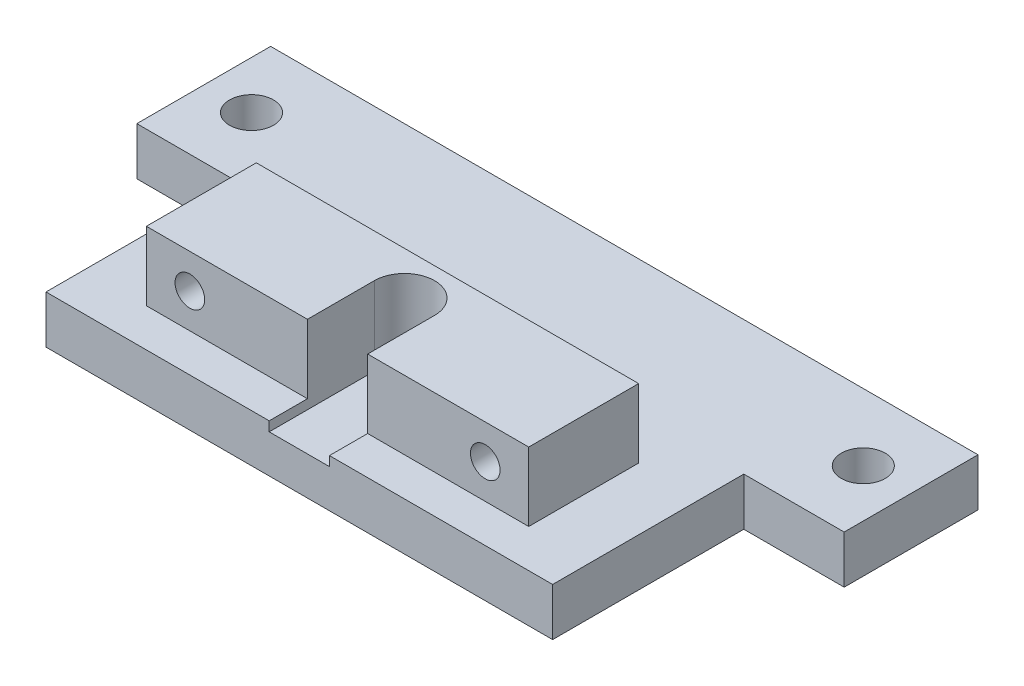
ISO-10303-21;
HEADER;
FILE_DESCRIPTION(('STEP AP214'),'2;1');
FILE_NAME('part.step','',(''),(''),'','','');
FILE_SCHEMA(('AUTOMOTIVE_DESIGN { 1 0 10303 214 1 1 1 1 }'));
ENDSEC;
DATA;
#1=APPLICATION_CONTEXT('core data for automotive mechanical design processes');
#2=APPLICATION_PROTOCOL_DEFINITION('international standard','automotive_design',2000,#1);
#3=PRODUCT_CONTEXT('',#1,'mechanical');
#4=PRODUCT('Part','Part','',(#3));
#5=PRODUCT_RELATED_PRODUCT_CATEGORY('part','',(#4));
#6=PRODUCT_DEFINITION_FORMATION('','',#4);
#7=PRODUCT_DEFINITION_CONTEXT('part definition',#1,'design');
#8=PRODUCT_DEFINITION('design','',#6,#7);
#9=PRODUCT_DEFINITION_SHAPE('','',#8);
#10=(LENGTH_UNIT() NAMED_UNIT(*) SI_UNIT(.MILLI.,.METRE.));
#11=(NAMED_UNIT(*) PLANE_ANGLE_UNIT() SI_UNIT($,.RADIAN.));
#12=(NAMED_UNIT(*) SI_UNIT($,.STERADIAN.) SOLID_ANGLE_UNIT());
#13=UNCERTAINTY_MEASURE_WITH_UNIT(LENGTH_MEASURE(1.E-05),#10,'distance_accuracy_value','');
#14=(GEOMETRIC_REPRESENTATION_CONTEXT(3) GLOBAL_UNCERTAINTY_ASSIGNED_CONTEXT((#13)) GLOBAL_UNIT_ASSIGNED_CONTEXT((#10,
#11,#12)) REPRESENTATION_CONTEXT('',''));
#15=CARTESIAN_POINT('',(0.,0.,0.));
#16=DIRECTION('',(0.,0.,1.));
#17=DIRECTION('',(1.,0.,0.));
#18=AXIS2_PLACEMENT_3D('',#15,#16,#17);
#19=CARTESIAN_POINT('',(0.,5.2,20.));
#20=DIRECTION('',(0.,0.,-1.));
#21=DIRECTION('',(-1.,0.,0.));
#22=AXIS2_PLACEMENT_3D('',#19,#20,#21);
#23=PLANE('',#22);
#24=DIRECTION('',(0.,-1.,0.));
#25=VECTOR('',#24,1.);
#26=CARTESIAN_POINT('',(10.5,5.2,20.));
#27=LINE('',#26,#25);
#28=CARTESIAN_POINT('',(10.5,5.2,20.));
#29=VERTEX_POINT('',#28);
#30=CARTESIAN_POINT('',(10.5,0.2,20.));
#31=VERTEX_POINT('',#30);
#32=EDGE_CURVE('E53',#29,#31,#27,.T.);
#33=ORIENTED_EDGE('',*,*,#32,.T.);
#34=DIRECTION('',(-1.,0.,0.));
#35=VECTOR('',#34,1.);
#36=CARTESIAN_POINT('',(74.,0.2,20.));
#37=LINE('',#36,#35);
#38=CARTESIAN_POINT('',(63.5,0.2,20.));
#39=VERTEX_POINT('',#38);
#40=EDGE_CURVE('E177',#39,#31,#37,.T.);
#41=ORIENTED_EDGE('',*,*,#40,.F.);
#42=DIRECTION('',(0.,-1.,0.));
#43=VECTOR('',#42,1.);
#44=CARTESIAN_POINT('',(63.5,5.2,20.));
#45=LINE('',#44,#43);
#46=CARTESIAN_POINT('',(63.5,5.2,20.));
#47=VERTEX_POINT('',#46);
#48=EDGE_CURVE('E202',#47,#39,#45,.T.);
#49=ORIENTED_EDGE('',*,*,#48,.F.);
#50=DIRECTION('',(1.,0.,0.));
#51=VECTOR('',#50,1.);
#52=CARTESIAN_POINT('',(0.,5.2,20.));
#53=LINE('',#52,#51);
#54=CARTESIAN_POINT('',(40.15,5.2,20.));
#55=VERTEX_POINT('',#54);
#56=EDGE_CURVE('E316',#55,#47,#53,.T.);
#57=ORIENTED_EDGE('',*,*,#56,.F.);
#58=DIRECTION('',(0.,1.,0.));
#59=VECTOR('',#58,1.);
#60=CARTESIAN_POINT('',(40.15,4.2,20.));
#61=LINE('',#60,#59);
#62=CARTESIAN_POINT('',(40.15,4.2,20.));
#63=VERTEX_POINT('',#62);
#64=EDGE_CURVE('E304',#63,#55,#61,.T.);
#65=ORIENTED_EDGE('',*,*,#64,.F.);
#66=DIRECTION('',(1.,0.,0.));
#67=VECTOR('',#66,1.);
#68=CARTESIAN_POINT('',(0.,4.2,20.));
#69=LINE('',#68,#67);
#70=CARTESIAN_POINT('',(33.85,4.2,20.));
#71=VERTEX_POINT('',#70);
#72=EDGE_CURVE('E298',#71,#63,#69,.T.);
#73=ORIENTED_EDGE('',*,*,#72,.F.);
#74=DIRECTION('',(0.,1.,0.));
#75=VECTOR('',#74,1.);
#76=CARTESIAN_POINT('',(33.85,4.2,20.));
#77=LINE('',#76,#75);
#78=CARTESIAN_POINT('',(33.85,5.2,20.));
#79=VERTEX_POINT('',#78);
#80=EDGE_CURVE('E308',#71,#79,#77,.T.);
#81=ORIENTED_EDGE('',*,*,#80,.T.);
#82=EDGE_CURVE('E213',#29,#79,#53,.T.);
#83=ORIENTED_EDGE('',*,*,#82,.F.);
#84=EDGE_LOOP('',(#33,#41,#49,#57,#65,#73,#81,#83));
#85=FACE_BOUND('',#84,.T.);
#86=ADVANCED_FACE('F44',(#85),#23,.F.);
#87=CARTESIAN_POINT('',(0.,5.2,0.));
#88=DIRECTION('',(0.,1.,0.));
#89=DIRECTION('',(0.,0.,1.));
#90=AXIS2_PLACEMENT_3D('',#87,#88,#89);
#91=PLANE('',#90);
#92=DIRECTION('',(1.,0.,0.));
#93=VECTOR('',#92,1.);
#94=CARTESIAN_POINT('',(40.15,5.2,16.));
#95=LINE('',#94,#93);
#96=CARTESIAN_POINT('',(40.15,5.2,16.));
#97=VERTEX_POINT('',#96);
#98=CARTESIAN_POINT('',(57.,5.2,16.));
#99=VERTEX_POINT('',#98);
#100=EDGE_CURVE('E266',#97,#99,#95,.T.);
#101=ORIENTED_EDGE('',*,*,#100,.F.);
#102=DIRECTION('',(0.,0.,1.));
#103=VECTOR('',#102,1.);
#104=CARTESIAN_POINT('',(40.15,5.2,0.));
#105=LINE('',#104,#103);
#106=EDGE_CURVE('E288',#97,#55,#105,.T.);
#107=ORIENTED_EDGE('',*,*,#106,.T.);
#108=ORIENTED_EDGE('',*,*,#56,.T.);
#109=DIRECTION('',(0.,0.,1.));
#110=VECTOR('',#109,1.);
#111=CARTESIAN_POINT('',(63.5,5.2,0.));
#112=LINE('',#111,#110);
#113=CARTESIAN_POINT('',(63.5,5.2,0.));
#114=VERTEX_POINT('',#113);
#115=EDGE_CURVE('E318',#114,#47,#112,.T.);
#116=ORIENTED_EDGE('',*,*,#115,.F.);
#117=DIRECTION('',(1.,0.,0.));
#118=VECTOR('',#117,1.);
#119=CARTESIAN_POINT('',(0.,5.2,0.));
#120=LINE('',#119,#118);
#121=CARTESIAN_POINT('',(74.,5.2,0.));
#122=VERTEX_POINT('',#121);
#123=EDGE_CURVE('E314',#114,#122,#120,.T.);
#124=ORIENTED_EDGE('',*,*,#123,.T.);
#125=DIRECTION('',(0.,0.,-1.));
#126=VECTOR('',#125,1.);
#127=CARTESIAN_POINT('',(74.,5.2,0.));
#128=LINE('',#127,#126);
#129=CARTESIAN_POINT('',(74.,5.2,-14.));
#130=VERTEX_POINT('',#129);
#131=EDGE_CURVE('E321',#122,#130,#128,.T.);
#132=ORIENTED_EDGE('',*,*,#131,.T.);
#133=DIRECTION('',(1.,0.,0.));
#134=VECTOR('',#133,1.);
#135=CARTESIAN_POINT('',(0.,5.2,-14.));
#136=LINE('',#135,#134);
#137=CARTESIAN_POINT('',(0.,5.2,-14.));
#138=VERTEX_POINT('',#137);
#139=EDGE_CURVE('E191',#138,#130,#136,.T.);
#140=ORIENTED_EDGE('',*,*,#139,.F.);
#141=DIRECTION('',(0.,0.,-1.));
#142=VECTOR('',#141,1.);
#143=CARTESIAN_POINT('',(0.,5.2,0.));
#144=LINE('',#143,#142);
#145=CARTESIAN_POINT('',(0.,5.2,0.));
#146=VERTEX_POINT('',#145);
#147=EDGE_CURVE('E324',#146,#138,#144,.T.);
#148=ORIENTED_EDGE('',*,*,#147,.F.);
#149=CARTESIAN_POINT('',(10.5,5.2,0.));
#150=VERTEX_POINT('',#149);
#151=EDGE_CURVE('E307',#146,#150,#120,.T.);
#152=ORIENTED_EDGE('',*,*,#151,.T.);
#153=DIRECTION('',(0.,0.,1.));
#154=VECTOR('',#153,1.);
#155=CARTESIAN_POINT('',(10.5,5.2,0.));
#156=LINE('',#155,#154);
#157=EDGE_CURVE('E216',#150,#29,#156,.T.);
#158=ORIENTED_EDGE('',*,*,#157,.T.);
#159=ORIENTED_EDGE('',*,*,#82,.T.);
#160=DIRECTION('',(0.,0.,1.));
#161=VECTOR('',#160,1.);
#162=CARTESIAN_POINT('',(33.85,5.2,0.));
#163=LINE('',#162,#161);
#164=CARTESIAN_POINT('',(33.85,5.2,16.));
#165=VERTEX_POINT('',#164);
#166=EDGE_CURVE('E292',#165,#79,#163,.T.);
#167=ORIENTED_EDGE('',*,*,#166,.F.);
#168=DIRECTION('',(1.,0.,0.));
#169=VECTOR('',#168,1.);
#170=CARTESIAN_POINT('',(17.,5.2,16.));
#171=LINE('',#170,#169);
#172=CARTESIAN_POINT('',(17.,5.2,16.));
#173=VERTEX_POINT('',#172);
#174=EDGE_CURVE('E263',#173,#165,#171,.T.);
#175=ORIENTED_EDGE('',*,*,#174,.F.);
#176=DIRECTION('',(0.,0.,1.));
#177=VECTOR('',#176,1.);
#178=CARTESIAN_POINT('',(17.,5.2,16.));
#179=LINE('',#178,#177);
#180=CARTESIAN_POINT('',(17.,5.2,4.5));
#181=VERTEX_POINT('',#180);
#182=EDGE_CURVE('E239',#181,#173,#179,.T.);
#183=ORIENTED_EDGE('',*,*,#182,.F.);
#184=DIRECTION('',(-1.,0.,0.));
#185=VECTOR('',#184,1.);
#186=CARTESIAN_POINT('',(17.,5.2,4.5));
#187=LINE('',#186,#185);
#188=CARTESIAN_POINT('',(57.,5.2,4.5));
#189=VERTEX_POINT('',#188);
#190=EDGE_CURVE('E244',#189,#181,#187,.T.);
#191=ORIENTED_EDGE('',*,*,#190,.F.);
#192=DIRECTION('',(0.,0.,-1.));
#193=VECTOR('',#192,1.);
#194=CARTESIAN_POINT('',(57.,5.2,16.));
#195=LINE('',#194,#193);
#196=EDGE_CURVE('E68',#99,#189,#195,.T.);
#197=ORIENTED_EDGE('',*,*,#196,.F.);
#198=EDGE_LOOP('',(#101,#107,#108,#116,#124,#132,#140,#148,#152,#158,#159,#167,#175,#183,#191,#197));
#199=FACE_BOUND('',#198,.T.);
#200=CARTESIAN_POINT('',(5.,5.2,-7.));
#201=DIRECTION('',(0.,1.,0.));
#202=DIRECTION('',(0.,0.,1.));
#203=AXIS2_PLACEMENT_3D('',#200,#201,#202);
#204=CIRCLE('',#203,2.3);
#205=CARTESIAN_POINT('',(5.,5.2,-4.7));
#206=VERTEX_POINT('',#205);
#207=EDGE_CURVE('E327',#206,#206,#204,.T.);
#208=ORIENTED_EDGE('',*,*,#207,.F.);
#209=EDGE_LOOP('',(#208));
#210=FACE_BOUND('',#209,.T.);
#211=CARTESIAN_POINT('',(69.,5.2,-7.));
#212=DIRECTION('',(0.,1.,0.));
#213=DIRECTION('',(0.,0.,1.));
#214=AXIS2_PLACEMENT_3D('',#211,#212,#213);
#215=CIRCLE('',#214,2.30000000000001);
#216=CARTESIAN_POINT('',(69.,5.2,-4.69999999999999));
#217=VERTEX_POINT('',#216);
#218=EDGE_CURVE('E330',#217,#217,#215,.F.);
#219=ORIENTED_EDGE('',*,*,#218,.T.);
#220=EDGE_LOOP('',(#219));
#221=FACE_BOUND('',#220,.T.);
#222=ADVANCED_FACE('F354',(#199,#210,#221),#91,.T.);
#223=CARTESIAN_POINT('',(0.,5.2,0.));
#224=DIRECTION('',(0.,0.,-1.));
#225=DIRECTION('',(-1.,0.,0.));
#226=AXIS2_PLACEMENT_3D('',#223,#224,#225);
#227=PLANE('',#226);
#228=DIRECTION('',(0.,-1.,0.));
#229=VECTOR('',#228,1.);
#230=CARTESIAN_POINT('',(0.,5.2,0.));
#231=LINE('',#230,#229);
#232=CARTESIAN_POINT('',(0.,0.2,0.));
#233=VERTEX_POINT('',#232);
#234=EDGE_CURVE('E196',#146,#233,#231,.T.);
#235=ORIENTED_EDGE('',*,*,#234,.T.);
#236=DIRECTION('',(1.,0.,0.));
#237=VECTOR('',#236,1.);
#238=CARTESIAN_POINT('',(0.,0.2,0.));
#239=LINE('',#238,#237);
#240=CARTESIAN_POINT('',(10.5,0.2,0.));
#241=VERTEX_POINT('',#240);
#242=EDGE_CURVE('E60',#233,#241,#239,.T.);
#243=ORIENTED_EDGE('',*,*,#242,.T.);
#244=DIRECTION('',(0.,-1.,0.));
#245=VECTOR('',#244,1.);
#246=CARTESIAN_POINT('',(10.5,5.2,0.));
#247=LINE('',#246,#245);
#248=EDGE_CURVE('E11',#150,#241,#247,.T.);
#249=ORIENTED_EDGE('',*,*,#248,.F.);
#250=ORIENTED_EDGE('',*,*,#151,.F.);
#251=EDGE_LOOP('',(#235,#243,#249,#250));
#252=FACE_BOUND('',#251,.T.);
#253=ADVANCED_FACE('F335',(#252),#227,.F.);
#254=CARTESIAN_POINT('',(10.5,5.2,0.));
#255=DIRECTION('',(1.,0.,0.));
#256=DIRECTION('',(0.,0.,-1.));
#257=AXIS2_PLACEMENT_3D('',#254,#255,#256);
#258=PLANE('',#257);
#259=ORIENTED_EDGE('',*,*,#248,.T.);
#260=DIRECTION('',(0.,0.,1.));
#261=VECTOR('',#260,1.);
#262=CARTESIAN_POINT('',(10.5,0.2,0.));
#263=LINE('',#262,#261);
#264=EDGE_CURVE('E218',#241,#31,#263,.T.);
#265=ORIENTED_EDGE('',*,*,#264,.T.);
#266=ORIENTED_EDGE('',*,*,#32,.F.);
#267=ORIENTED_EDGE('',*,*,#157,.F.);
#268=EDGE_LOOP('',(#259,#265,#266,#267));
#269=FACE_BOUND('',#268,.T.);
#270=ADVANCED_FACE('F46',(#269),#258,.F.);
#271=CARTESIAN_POINT('',(63.5,5.2,0.));
#272=DIRECTION('',(1.,0.,0.));
#273=DIRECTION('',(0.,0.,-1.));
#274=AXIS2_PLACEMENT_3D('',#271,#272,#273);
#275=PLANE('',#274);
#276=DIRECTION('',(0.,0.,1.));
#277=VECTOR('',#276,1.);
#278=CARTESIAN_POINT('',(63.5,0.2,0.));
#279=LINE('',#278,#277);
#280=CARTESIAN_POINT('',(63.5,0.2,0.));
#281=VERTEX_POINT('',#280);
#282=EDGE_CURVE('E220',#281,#39,#279,.T.);
#283=ORIENTED_EDGE('',*,*,#282,.F.);
#284=DIRECTION('',(0.,-1.,0.));
#285=VECTOR('',#284,1.);
#286=CARTESIAN_POINT('',(63.5,5.2,0.));
#287=LINE('',#286,#285);
#288=EDGE_CURVE('E194',#114,#281,#287,.T.);
#289=ORIENTED_EDGE('',*,*,#288,.F.);
#290=ORIENTED_EDGE('',*,*,#115,.T.);
#291=ORIENTED_EDGE('',*,*,#48,.T.);
#292=EDGE_LOOP('',(#283,#289,#290,#291));
#293=FACE_BOUND('',#292,.T.);
#294=ADVANCED_FACE('F349',(#293),#275,.T.);
#295=ORIENTED_EDGE('',*,*,#288,.T.);
#296=DIRECTION('',(1.,0.,0.));
#297=VECTOR('',#296,1.);
#298=CARTESIAN_POINT('',(0.,0.2,0.));
#299=LINE('',#298,#297);
#300=CARTESIAN_POINT('',(74.,0.2,0.));
#301=VERTEX_POINT('',#300);
#302=EDGE_CURVE('E224',#281,#301,#299,.T.);
#303=ORIENTED_EDGE('',*,*,#302,.T.);
#304=DIRECTION('',(0.,-1.,0.));
#305=VECTOR('',#304,1.);
#306=CARTESIAN_POINT('',(74.,5.2,0.));
#307=LINE('',#306,#305);
#308=EDGE_CURVE('E187',#122,#301,#307,.T.);
#309=ORIENTED_EDGE('',*,*,#308,.F.);
#310=ORIENTED_EDGE('',*,*,#123,.F.);
#311=EDGE_LOOP('',(#295,#303,#309,#310));
#312=FACE_BOUND('',#311,.T.);
#313=ADVANCED_FACE('F345',(#312),#227,.F.);
#314=CARTESIAN_POINT('',(74.,5.2,0.));
#315=DIRECTION('',(-1.,0.,0.));
#316=DIRECTION('',(0.,0.,1.));
#317=AXIS2_PLACEMENT_3D('',#314,#315,#316);
#318=PLANE('',#317);
#319=ORIENTED_EDGE('',*,*,#308,.T.);
#320=DIRECTION('',(0.,0.,-1.));
#321=VECTOR('',#320,1.);
#322=CARTESIAN_POINT('',(74.,0.2,-14.));
#323=LINE('',#322,#321);
#324=CARTESIAN_POINT('',(74.,0.2,-14.));
#325=VERTEX_POINT('',#324);
#326=EDGE_CURVE('E171',#301,#325,#323,.T.);
#327=ORIENTED_EDGE('',*,*,#326,.T.);
#328=DIRECTION('',(0.,-1.,0.));
#329=VECTOR('',#328,1.);
#330=CARTESIAN_POINT('',(74.,5.2,-14.));
#331=LINE('',#330,#329);
#332=EDGE_CURVE('E184',#130,#325,#331,.T.);
#333=ORIENTED_EDGE('',*,*,#332,.F.);
#334=ORIENTED_EDGE('',*,*,#131,.F.);
#335=EDGE_LOOP('',(#319,#327,#333,#334));
#336=FACE_BOUND('',#335,.T.);
#337=ADVANCED_FACE('F182',(#336),#318,.F.);
#338=CARTESIAN_POINT('',(0.,5.2,-14.));
#339=DIRECTION('',(0.,0.,-1.));
#340=DIRECTION('',(-1.,0.,0.));
#341=AXIS2_PLACEMENT_3D('',#338,#339,#340);
#342=PLANE('',#341);
#343=DIRECTION('',(-1.,0.,0.));
#344=VECTOR('',#343,1.);
#345=CARTESIAN_POINT('',(74.,0.2,-14.));
#346=LINE('',#345,#344);
#347=CARTESIAN_POINT('',(0.,0.2,-14.));
#348=VERTEX_POINT('',#347);
#349=EDGE_CURVE('E168',#325,#348,#346,.T.);
#350=ORIENTED_EDGE('',*,*,#349,.T.);
#351=DIRECTION('',(0.,-1.,0.));
#352=VECTOR('',#351,1.);
#353=CARTESIAN_POINT('',(0.,5.2,-14.));
#354=LINE('',#353,#352);
#355=EDGE_CURVE('E192',#138,#348,#354,.T.);
#356=ORIENTED_EDGE('',*,*,#355,.F.);
#357=ORIENTED_EDGE('',*,*,#139,.T.);
#358=ORIENTED_EDGE('',*,*,#332,.T.);
#359=EDGE_LOOP('',(#350,#356,#357,#358));
#360=FACE_BOUND('',#359,.T.);
#361=ADVANCED_FACE('F189',(#360),#342,.T.);
#362=CARTESIAN_POINT('',(5.,5.2,-7.));
#363=DIRECTION('',(0.,-1.,0.));
#364=DIRECTION('',(0.,0.,-1.));
#365=AXIS2_PLACEMENT_3D('',#362,#363,#364);
#366=CYLINDRICAL_SURFACE('',#365,2.3);
#367=CARTESIAN_POINT('',(5.,0.2,-7.));
#368=DIRECTION('',(0.,1.,0.));
#369=DIRECTION('',(0.,0.,1.));
#370=AXIS2_PLACEMENT_3D('',#367,#368,#369);
#371=CIRCLE('',#370,2.3);
#372=CARTESIAN_POINT('',(5.,0.2,-4.7));
#373=VERTEX_POINT('',#372);
#374=EDGE_CURVE('E342',#373,#373,#371,.T.);
#375=ORIENTED_EDGE('',*,*,#374,.F.);
#376=EDGE_LOOP('',(#375));
#377=FACE_BOUND('',#376,.T.);
#378=ORIENTED_EDGE('',*,*,#207,.T.);
#379=EDGE_LOOP('',(#378));
#380=FACE_BOUND('',#379,.T.);
#381=ADVANCED_FACE('F405',(#377,#380),#366,.F.);
#382=CARTESIAN_POINT('',(0.,5.2,0.));
#383=DIRECTION('',(-1.,0.,0.));
#384=DIRECTION('',(0.,0.,1.));
#385=AXIS2_PLACEMENT_3D('',#382,#383,#384);
#386=PLANE('',#385);
#387=DIRECTION('',(0.,0.,-1.));
#388=VECTOR('',#387,1.);
#389=CARTESIAN_POINT('',(0.,0.2,-14.));
#390=LINE('',#389,#388);
#391=EDGE_CURVE('E173',#233,#348,#390,.T.);
#392=ORIENTED_EDGE('',*,*,#391,.F.);
#393=ORIENTED_EDGE('',*,*,#234,.F.);
#394=ORIENTED_EDGE('',*,*,#147,.T.);
#395=ORIENTED_EDGE('',*,*,#355,.T.);
#396=EDGE_LOOP('',(#392,#393,#394,#395));
#397=FACE_BOUND('',#396,.T.);
#398=ADVANCED_FACE('F338',(#397),#386,.T.);
#399=CARTESIAN_POINT('',(69.,5.2,-7.));
#400=DIRECTION('',(0.,-1.,0.));
#401=DIRECTION('',(0.,0.,-1.));
#402=AXIS2_PLACEMENT_3D('',#399,#400,#401);
#403=CYLINDRICAL_SURFACE('',#402,2.30000000000001);
#404=CARTESIAN_POINT('',(69.,0.2,-7.));
#405=DIRECTION('',(0.,1.,0.));
#406=DIRECTION('',(0.,0.,1.));
#407=AXIS2_PLACEMENT_3D('',#404,#405,#406);
#408=CIRCLE('',#407,2.30000000000001);
#409=CARTESIAN_POINT('',(69.,0.2,-4.69999999999999));
#410=VERTEX_POINT('',#409);
#411=EDGE_CURVE('E48',#410,#410,#408,.F.);
#412=ORIENTED_EDGE('',*,*,#411,.T.);
#413=EDGE_LOOP('',(#412));
#414=FACE_BOUND('',#413,.T.);
#415=ORIENTED_EDGE('',*,*,#218,.F.);
#416=EDGE_LOOP('',(#415));
#417=FACE_BOUND('',#416,.T.);
#418=ADVANCED_FACE('F408',(#414,#417),#403,.F.);
#419=CARTESIAN_POINT('',(40.15,4.2,0.));
#420=DIRECTION('',(-1.,0.,0.));
#421=DIRECTION('',(0.,0.,1.));
#422=AXIS2_PLACEMENT_3D('',#419,#420,#421);
#423=PLANE('',#422);
#424=ORIENTED_EDGE('',*,*,#106,.F.);
#425=DIRECTION('',(0.,-1.,0.));
#426=VECTOR('',#425,1.);
#427=CARTESIAN_POINT('',(40.15,12.4,16.));
#428=LINE('',#427,#426);
#429=CARTESIAN_POINT('',(40.15,12.4,16.));
#430=VERTEX_POINT('',#429);
#431=EDGE_CURVE('E279',#430,#97,#428,.T.);
#432=ORIENTED_EDGE('',*,*,#431,.F.);
#433=DIRECTION('',(0.,0.,1.));
#434=VECTOR('',#433,1.);
#435=CARTESIAN_POINT('',(40.15,12.4,9.));
#436=LINE('',#435,#434);
#437=CARTESIAN_POINT('',(40.15,12.4,9.));
#438=VERTEX_POINT('',#437);
#439=EDGE_CURVE('E252',#438,#430,#436,.T.);
#440=ORIENTED_EDGE('',*,*,#439,.F.);
#441=DIRECTION('',(0.,1.,0.));
#442=VECTOR('',#441,1.);
#443=CARTESIAN_POINT('',(40.15,4.2,9.));
#444=LINE('',#443,#442);
#445=CARTESIAN_POINT('',(40.15,4.2,9.));
#446=VERTEX_POINT('',#445);
#447=EDGE_CURVE('E301',#446,#438,#444,.T.);
#448=ORIENTED_EDGE('',*,*,#447,.F.);
#449=DIRECTION('',(0.,0.,1.));
#450=VECTOR('',#449,1.);
#451=CARTESIAN_POINT('',(40.15,4.2,0.));
#452=LINE('',#451,#450);
#453=EDGE_CURVE('E289',#446,#63,#452,.T.);
#454=ORIENTED_EDGE('',*,*,#453,.T.);
#455=ORIENTED_EDGE('',*,*,#64,.T.);
#456=EDGE_LOOP('',(#424,#432,#440,#448,#454,#455));
#457=FACE_BOUND('',#456,.T.);
#458=ADVANCED_FACE('F359',(#457),#423,.T.);
#459=CARTESIAN_POINT('',(33.85,4.2,0.));
#460=DIRECTION('',(-1.,0.,0.));
#461=DIRECTION('',(0.,0.,1.));
#462=AXIS2_PLACEMENT_3D('',#459,#460,#461);
#463=PLANE('',#462);
#464=DIRECTION('',(0.,1.,0.));
#465=VECTOR('',#464,1.);
#466=CARTESIAN_POINT('',(33.85,4.2,9.));
#467=LINE('',#466,#465);
#468=CARTESIAN_POINT('',(33.85,4.2,9.));
#469=VERTEX_POINT('',#468);
#470=CARTESIAN_POINT('',(33.85,12.4,9.));
#471=VERTEX_POINT('',#470);
#472=EDGE_CURVE('E310',#469,#471,#467,.T.);
#473=ORIENTED_EDGE('',*,*,#472,.T.);
#474=DIRECTION('',(0.,0.,-1.));
#475=VECTOR('',#474,1.);
#476=CARTESIAN_POINT('',(33.85,12.4,9.));
#477=LINE('',#476,#475);
#478=CARTESIAN_POINT('',(33.85,12.4,16.));
#479=VERTEX_POINT('',#478);
#480=EDGE_CURVE('E246',#479,#471,#477,.T.);
#481=ORIENTED_EDGE('',*,*,#480,.F.);
#482=DIRECTION('',(0.,-1.,0.));
#483=VECTOR('',#482,1.);
#484=CARTESIAN_POINT('',(33.85,12.4,16.));
#485=LINE('',#484,#483);
#486=EDGE_CURVE('E282',#479,#165,#485,.T.);
#487=ORIENTED_EDGE('',*,*,#486,.T.);
#488=ORIENTED_EDGE('',*,*,#166,.T.);
#489=ORIENTED_EDGE('',*,*,#80,.F.);
#490=DIRECTION('',(0.,0.,1.));
#491=VECTOR('',#490,1.);
#492=CARTESIAN_POINT('',(33.85,4.2,0.));
#493=LINE('',#492,#491);
#494=EDGE_CURVE('E295',#469,#71,#493,.T.);
#495=ORIENTED_EDGE('',*,*,#494,.F.);
#496=EDGE_LOOP('',(#473,#481,#487,#488,#489,#495));
#497=FACE_BOUND('',#496,.T.);
#498=ADVANCED_FACE('F372',(#497),#463,.F.);
#499=CARTESIAN_POINT('',(37.,4.2,9.));
#500=DIRECTION('',(0.,1.,0.));
#501=DIRECTION('',(0.,0.,1.));
#502=AXIS2_PLACEMENT_3D('',#499,#500,#501);
#503=CYLINDRICAL_SURFACE('',#502,3.15);
#504=ORIENTED_EDGE('',*,*,#447,.T.);
#505=CARTESIAN_POINT('',(37.,12.4,9.));
#506=DIRECTION('',(0.,-1.,0.));
#507=DIRECTION('',(0.,0.,1.));
#508=AXIS2_PLACEMENT_3D('',#505,#506,#507);
#509=CIRCLE('',#508,3.15);
#510=EDGE_CURVE('E249',#471,#438,#509,.T.);
#511=ORIENTED_EDGE('',*,*,#510,.F.);
#512=ORIENTED_EDGE('',*,*,#472,.F.);
#513=CARTESIAN_POINT('',(37.,4.2,9.));
#514=DIRECTION('',(0.,1.,0.));
#515=DIRECTION('',(0.,0.,1.));
#516=AXIS2_PLACEMENT_3D('',#513,#514,#515);
#517=CIRCLE('',#516,3.15);
#518=EDGE_CURVE('E291',#446,#469,#517,.T.);
#519=ORIENTED_EDGE('',*,*,#518,.F.);
#520=EDGE_LOOP('',(#504,#511,#512,#519));
#521=FACE_BOUND('',#520,.T.);
#522=ADVANCED_FACE('F377',(#521),#503,.F.);
#523=CARTESIAN_POINT('',(0.,4.2,0.));
#524=DIRECTION('',(0.,1.,0.));
#525=DIRECTION('',(0.,0.,1.));
#526=AXIS2_PLACEMENT_3D('',#523,#524,#525);
#527=PLANE('',#526);
#528=ORIENTED_EDGE('',*,*,#453,.F.);
#529=ORIENTED_EDGE('',*,*,#518,.T.);
#530=ORIENTED_EDGE('',*,*,#494,.T.);
#531=ORIENTED_EDGE('',*,*,#72,.T.);
#532=EDGE_LOOP('',(#528,#529,#530,#531));
#533=FACE_BOUND('',#532,.T.);
#534=ADVANCED_FACE('F364',(#533),#527,.T.);
#535=CARTESIAN_POINT('',(17.,12.4,16.));
#536=DIRECTION('',(1.,0.,0.));
#537=DIRECTION('',(0.,0.,-1.));
#538=AXIS2_PLACEMENT_3D('',#535,#536,#537);
#539=PLANE('',#538);
#540=ORIENTED_EDGE('',*,*,#182,.T.);
#541=DIRECTION('',(0.,-1.,0.));
#542=VECTOR('',#541,1.);
#543=CARTESIAN_POINT('',(17.,12.4,16.));
#544=LINE('',#543,#542);
#545=CARTESIAN_POINT('',(17.,12.4,16.));
#546=VERTEX_POINT('',#545);
#547=EDGE_CURVE('E285',#546,#173,#544,.T.);
#548=ORIENTED_EDGE('',*,*,#547,.F.);
#549=DIRECTION('',(0.,0.,1.));
#550=VECTOR('',#549,1.);
#551=CARTESIAN_POINT('',(17.,12.4,16.));
#552=LINE('',#551,#550);
#553=CARTESIAN_POINT('',(17.,12.4,4.5));
#554=VERTEX_POINT('',#553);
#555=EDGE_CURVE('E240',#554,#546,#552,.T.);
#556=ORIENTED_EDGE('',*,*,#555,.F.);
#557=DIRECTION('',(0.,-1.,0.));
#558=VECTOR('',#557,1.);
#559=CARTESIAN_POINT('',(17.,12.4,4.5));
#560=LINE('',#559,#558);
#561=EDGE_CURVE('E260',#554,#181,#560,.T.);
#562=ORIENTED_EDGE('',*,*,#561,.T.);
#563=EDGE_LOOP('',(#540,#548,#556,#562));
#564=FACE_BOUND('',#563,.T.);
#565=ADVANCED_FACE('F385',(#564),#539,.F.);
#566=CARTESIAN_POINT('',(17.,12.4,16.));
#567=DIRECTION('',(0.,0.,-1.));
#568=DIRECTION('',(-1.,0.,0.));
#569=AXIS2_PLACEMENT_3D('',#566,#567,#568);
#570=PLANE('',#569);
#571=CARTESIAN_POINT('',(21.55,8.8,16.));
#572=DIRECTION('',(0.,0.,-1.));
#573=DIRECTION('',(-1.,0.,0.));
#574=AXIS2_PLACEMENT_3D('',#571,#572,#573);
#575=CIRCLE('',#574,1.55);
#576=CARTESIAN_POINT('',(20.,8.8,16.));
#577=VERTEX_POINT('',#576);
#578=EDGE_CURVE('E231',#577,#577,#575,.T.);
#579=ORIENTED_EDGE('',*,*,#578,.T.);
#580=EDGE_LOOP('',(#579));
#581=FACE_BOUND('',#580,.T.);
#582=ORIENTED_EDGE('',*,*,#174,.T.);
#583=ORIENTED_EDGE('',*,*,#486,.F.);
#584=DIRECTION('',(1.,0.,0.));
#585=VECTOR('',#584,1.);
#586=CARTESIAN_POINT('',(17.,12.4,16.));
#587=LINE('',#586,#585);
#588=EDGE_CURVE('E243',#546,#479,#587,.T.);
#589=ORIENTED_EDGE('',*,*,#588,.F.);
#590=ORIENTED_EDGE('',*,*,#547,.T.);
#591=EDGE_LOOP('',(#582,#583,#589,#590));
#592=FACE_BOUND('',#591,.T.);
#593=ADVANCED_FACE('F369',(#581,#592),#570,.F.);
#594=CARTESIAN_POINT('',(40.15,12.4,16.));
#595=DIRECTION('',(0.,0.,-1.));
#596=DIRECTION('',(-1.,0.,0.));
#597=AXIS2_PLACEMENT_3D('',#594,#595,#596);
#598=PLANE('',#597);
#599=CARTESIAN_POINT('',(52.45,8.8,16.));
#600=DIRECTION('',(0.,0.,-1.));
#601=DIRECTION('',(-1.,0.,0.));
#602=AXIS2_PLACEMENT_3D('',#599,#600,#601);
#603=CIRCLE('',#602,1.55);
#604=CARTESIAN_POINT('',(50.9,8.8,16.));
#605=VERTEX_POINT('',#604);
#606=EDGE_CURVE('E236',#605,#605,#603,.T.);
#607=ORIENTED_EDGE('',*,*,#606,.T.);
#608=EDGE_LOOP('',(#607));
#609=FACE_BOUND('',#608,.T.);
#610=ORIENTED_EDGE('',*,*,#100,.T.);
#611=DIRECTION('',(0.,-1.,0.));
#612=VECTOR('',#611,1.);
#613=CARTESIAN_POINT('',(57.,12.4,16.));
#614=LINE('',#613,#612);
#615=CARTESIAN_POINT('',(57.,12.4,16.));
#616=VERTEX_POINT('',#615);
#617=EDGE_CURVE('E276',#616,#99,#614,.T.);
#618=ORIENTED_EDGE('',*,*,#617,.F.);
#619=DIRECTION('',(1.,0.,0.));
#620=VECTOR('',#619,1.);
#621=CARTESIAN_POINT('',(40.15,12.4,16.));
#622=LINE('',#621,#620);
#623=EDGE_CURVE('E254',#430,#616,#622,.T.);
#624=ORIENTED_EDGE('',*,*,#623,.F.);
#625=ORIENTED_EDGE('',*,*,#431,.T.);
#626=EDGE_LOOP('',(#610,#618,#624,#625));
#627=FACE_BOUND('',#626,.T.);
#628=ADVANCED_FACE('F453',(#609,#627),#598,.F.);
#629=CARTESIAN_POINT('',(57.,12.4,16.));
#630=DIRECTION('',(-1.,0.,0.));
#631=DIRECTION('',(0.,0.,1.));
#632=AXIS2_PLACEMENT_3D('',#629,#630,#631);
#633=PLANE('',#632);
#634=ORIENTED_EDGE('',*,*,#196,.T.);
#635=DIRECTION('',(0.,-1.,0.));
#636=VECTOR('',#635,1.);
#637=CARTESIAN_POINT('',(57.,12.4,4.5));
#638=LINE('',#637,#636);
#639=CARTESIAN_POINT('',(57.,12.4,4.5));
#640=VERTEX_POINT('',#639);
#641=EDGE_CURVE('E273',#640,#189,#638,.T.);
#642=ORIENTED_EDGE('',*,*,#641,.F.);
#643=DIRECTION('',(0.,0.,-1.));
#644=VECTOR('',#643,1.);
#645=CARTESIAN_POINT('',(57.,12.4,16.));
#646=LINE('',#645,#644);
#647=EDGE_CURVE('E256',#616,#640,#646,.T.);
#648=ORIENTED_EDGE('',*,*,#647,.F.);
#649=ORIENTED_EDGE('',*,*,#617,.T.);
#650=EDGE_LOOP('',(#634,#642,#648,#649));
#651=FACE_BOUND('',#650,.T.);
#652=ADVANCED_FACE('F464',(#651),#633,.F.);
#653=CARTESIAN_POINT('',(17.,12.4,4.5));
#654=DIRECTION('',(0.,0.,1.));
#655=DIRECTION('',(1.,0.,0.));
#656=AXIS2_PLACEMENT_3D('',#653,#654,#655);
#657=PLANE('',#656);
#658=CARTESIAN_POINT('',(52.45,8.8,4.5));
#659=DIRECTION('',(0.,0.,-1.));
#660=DIRECTION('',(-1.,0.,0.));
#661=AXIS2_PLACEMENT_3D('',#658,#659,#660);
#662=CIRCLE('',#661,1.55);
#663=CARTESIAN_POINT('',(50.9,8.8,4.5));
#664=VERTEX_POINT('',#663);
#665=EDGE_CURVE('E228',#664,#664,#662,.T.);
#666=ORIENTED_EDGE('',*,*,#665,.F.);
#667=EDGE_LOOP('',(#666));
#668=FACE_BOUND('',#667,.T.);
#669=CARTESIAN_POINT('',(21.55,8.8,4.5));
#670=DIRECTION('',(0.,0.,-1.));
#671=DIRECTION('',(-1.,0.,0.));
#672=AXIS2_PLACEMENT_3D('',#669,#670,#671);
#673=CIRCLE('',#672,1.55);
#674=CARTESIAN_POINT('',(20.,8.8,4.5));
#675=VERTEX_POINT('',#674);
#676=EDGE_CURVE('E222',#675,#675,#673,.T.);
#677=ORIENTED_EDGE('',*,*,#676,.F.);
#678=EDGE_LOOP('',(#677));
#679=FACE_BOUND('',#678,.T.);
#680=ORIENTED_EDGE('',*,*,#190,.T.);
#681=ORIENTED_EDGE('',*,*,#561,.F.);
#682=DIRECTION('',(-1.,0.,0.));
#683=VECTOR('',#682,1.);
#684=CARTESIAN_POINT('',(17.,12.4,4.5));
#685=LINE('',#684,#683);
#686=EDGE_CURVE('E258',#640,#554,#685,.T.);
#687=ORIENTED_EDGE('',*,*,#686,.F.);
#688=ORIENTED_EDGE('',*,*,#641,.T.);
#689=EDGE_LOOP('',(#680,#681,#687,#688));
#690=FACE_BOUND('',#689,.T.);
#691=ADVANCED_FACE('F474',(#668,#679,#690),#657,.F.);
#692=CARTESIAN_POINT('',(37.,12.4,9.));
#693=DIRECTION('',(0.,1.,0.));
#694=DIRECTION('',(0.,0.,1.));
#695=AXIS2_PLACEMENT_3D('',#692,#693,#694);
#696=PLANE('',#695);
#697=ORIENTED_EDGE('',*,*,#555,.T.);
#698=ORIENTED_EDGE('',*,*,#588,.T.);
#699=ORIENTED_EDGE('',*,*,#480,.T.);
#700=ORIENTED_EDGE('',*,*,#510,.T.);
#701=ORIENTED_EDGE('',*,*,#439,.T.);
#702=ORIENTED_EDGE('',*,*,#623,.T.);
#703=ORIENTED_EDGE('',*,*,#647,.T.);
#704=ORIENTED_EDGE('',*,*,#686,.T.);
#705=EDGE_LOOP('',(#697,#698,#699,#700,#701,#702,#703,#704));
#706=FACE_BOUND('',#705,.T.);
#707=ADVANCED_FACE('F375',(#706),#696,.T.);
#708=CARTESIAN_POINT('',(21.55,8.8,20.));
#709=DIRECTION('',(0.,0.,-1.));
#710=DIRECTION('',(-1.,0.,0.));
#711=AXIS2_PLACEMENT_3D('',#708,#709,#710);
#712=CYLINDRICAL_SURFACE('',#711,1.55);
#713=ORIENTED_EDGE('',*,*,#676,.T.);
#714=EDGE_LOOP('',(#713));
#715=FACE_BOUND('',#714,.T.);
#716=ORIENTED_EDGE('',*,*,#578,.F.);
#717=EDGE_LOOP('',(#716));
#718=FACE_BOUND('',#717,.T.);
#719=ADVANCED_FACE('F492',(#715,#718),#712,.F.);
#720=CARTESIAN_POINT('',(52.45,8.8,20.));
#721=DIRECTION('',(0.,0.,-1.));
#722=DIRECTION('',(-1.,0.,0.));
#723=AXIS2_PLACEMENT_3D('',#720,#721,#722);
#724=CYLINDRICAL_SURFACE('',#723,1.55);
#725=ORIENTED_EDGE('',*,*,#665,.T.);
#726=EDGE_LOOP('',(#725));
#727=FACE_BOUND('',#726,.T.);
#728=ORIENTED_EDGE('',*,*,#606,.F.);
#729=EDGE_LOOP('',(#728));
#730=FACE_BOUND('',#729,.T.);
#731=ADVANCED_FACE('F503',(#727,#730),#724,.F.);
#732=CARTESIAN_POINT('',(74.,0.2,-14.));
#733=DIRECTION('',(0.,1.,0.));
#734=DIRECTION('',(0.,0.,1.));
#735=AXIS2_PLACEMENT_3D('',#732,#733,#734);
#736=PLANE('',#735);
#737=ORIENTED_EDGE('',*,*,#374,.T.);
#738=EDGE_LOOP('',(#737));
#739=FACE_BOUND('',#738,.T.);
#740=ORIENTED_EDGE('',*,*,#411,.F.);
#741=EDGE_LOOP('',(#740));
#742=FACE_BOUND('',#741,.T.);
#743=ORIENTED_EDGE('',*,*,#391,.T.);
#744=ORIENTED_EDGE('',*,*,#349,.F.);
#745=ORIENTED_EDGE('',*,*,#326,.F.);
#746=ORIENTED_EDGE('',*,*,#302,.F.);
#747=ORIENTED_EDGE('',*,*,#282,.T.);
#748=ORIENTED_EDGE('',*,*,#40,.T.);
#749=ORIENTED_EDGE('',*,*,#264,.F.);
#750=ORIENTED_EDGE('',*,*,#242,.F.);
#751=EDGE_LOOP('',(#743,#744,#745,#746,#747,#748,#749,#750));
#752=FACE_BOUND('',#751,.T.);
#753=ADVANCED_FACE('F170',(#739,#742,#752),#736,.F.);
#754=CLOSED_SHELL('',(#86,#222,#253,#270,#294,#313,#337,#361,#381,#398,#418,#458,#498,#522,#534,
#565,#593,#628,#652,#691,#707,#719,#731,#753));
#755=MANIFOLD_SOLID_BREP('B2',#754);
#756=ADVANCED_BREP_SHAPE_REPRESENTATION('',(#18,#755),#14);
#757=SHAPE_DEFINITION_REPRESENTATION(#9,#756);
ENDSEC;
END-ISO-10303-21;
